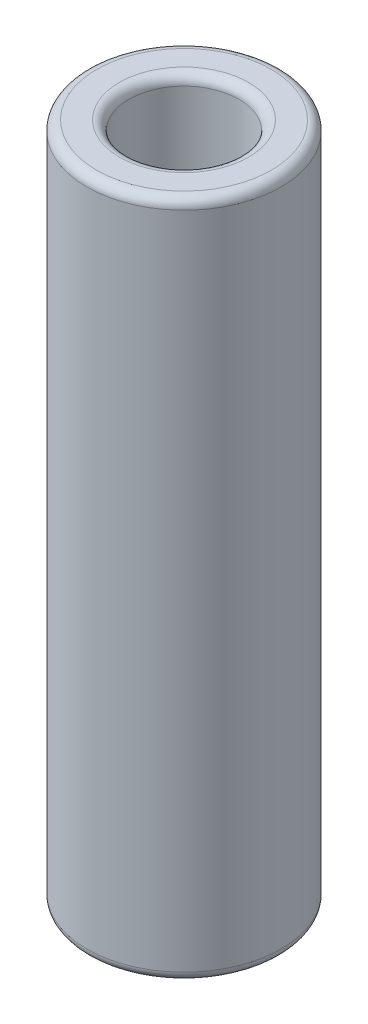
ISO-10303-21;
HEADER;
FILE_DESCRIPTION(('STEP AP214'),'2;1');
FILE_NAME('part.step','',(''),(''),'','','');
FILE_SCHEMA(('AUTOMOTIVE_DESIGN { 1 0 10303 214 1 1 1 1 }'));
ENDSEC;
DATA;
#1=APPLICATION_CONTEXT('core data for automotive mechanical design processes');
#2=APPLICATION_PROTOCOL_DEFINITION('international standard','automotive_design',2000,#1);
#3=PRODUCT_CONTEXT('',#1,'mechanical');
#4=PRODUCT('Part','Part','',(#3));
#5=PRODUCT_RELATED_PRODUCT_CATEGORY('part','',(#4));
#6=PRODUCT_DEFINITION_FORMATION('','',#4);
#7=PRODUCT_DEFINITION_CONTEXT('part definition',#1,'design');
#8=PRODUCT_DEFINITION('design','',#6,#7);
#9=PRODUCT_DEFINITION_SHAPE('','',#8);
#10=(LENGTH_UNIT() NAMED_UNIT(*) SI_UNIT(.MILLI.,.METRE.));
#11=(NAMED_UNIT(*) PLANE_ANGLE_UNIT() SI_UNIT($,.RADIAN.));
#12=(NAMED_UNIT(*) SI_UNIT($,.STERADIAN.) SOLID_ANGLE_UNIT());
#13=UNCERTAINTY_MEASURE_WITH_UNIT(LENGTH_MEASURE(1.E-05),#10,'distance_accuracy_value','');
#14=(GEOMETRIC_REPRESENTATION_CONTEXT(3) GLOBAL_UNCERTAINTY_ASSIGNED_CONTEXT((#13)) GLOBAL_UNIT_ASSIGNED_CONTEXT((#10,
#11,#12)) REPRESENTATION_CONTEXT('',''));
#15=CARTESIAN_POINT('',(0.,0.,0.));
#16=DIRECTION('',(0.,0.,1.));
#17=DIRECTION('',(1.,0.,0.));
#18=AXIS2_PLACEMENT_3D('',#15,#16,#17);
#19=CARTESIAN_POINT('',(0.,21.,0.));
#20=DIRECTION('',(0.,1.,0.));
#21=DIRECTION('',(0.,0.,1.));
#22=AXIS2_PLACEMENT_3D('',#19,#20,#21);
#23=PLANE('',#22);
#24=CARTESIAN_POINT('',(0.,21.,0.));
#25=DIRECTION('',(0.,1.,0.));
#26=DIRECTION('',(0.,0.,1.));
#27=AXIS2_PLACEMENT_3D('',#24,#25,#26);
#28=CIRCLE('',#27,2.);
#29=CARTESIAN_POINT('',(0.,21.,2.));
#30=VERTEX_POINT('',#29);
#31=EDGE_CURVE('E10',#30,#30,#28,.F.);
#32=ORIENTED_EDGE('',*,*,#31,.T.);
#33=EDGE_LOOP('',(#32));
#34=FACE_BOUND('',#33,.T.);
#35=CARTESIAN_POINT('',(0.,21.,0.));
#36=DIRECTION('',(0.,1.,0.));
#37=DIRECTION('',(0.,0.,1.));
#38=AXIS2_PLACEMENT_3D('',#35,#36,#37);
#39=CIRCLE('',#38,2.7);
#40=CARTESIAN_POINT('',(0.,21.,2.7));
#41=VERTEX_POINT('',#40);
#42=EDGE_CURVE('E49',#41,#41,#39,.T.);
#43=ORIENTED_EDGE('',*,*,#42,.T.);
#44=EDGE_LOOP('',(#43));
#45=FACE_BOUND('',#44,.T.);
#46=ADVANCED_FACE('F41',(#34,#45),#23,.T.);
#47=CARTESIAN_POINT('',(0.,0.,0.));
#48=DIRECTION('',(0.,1.,0.));
#49=DIRECTION('',(0.,0.,1.));
#50=AXIS2_PLACEMENT_3D('',#47,#48,#49);
#51=PLANE('',#50);
#52=CARTESIAN_POINT('',(0.,0.,0.));
#53=DIRECTION('',(0.,1.,0.));
#54=DIRECTION('',(0.,0.,1.));
#55=AXIS2_PLACEMENT_3D('',#52,#53,#54);
#56=CIRCLE('',#55,2.);
#57=CARTESIAN_POINT('',(0.,0.,2.));
#58=VERTEX_POINT('',#57);
#59=EDGE_CURVE('E73',#58,#58,#56,.T.);
#60=ORIENTED_EDGE('',*,*,#59,.T.);
#61=EDGE_LOOP('',(#60));
#62=FACE_BOUND('',#61,.T.);
#63=CARTESIAN_POINT('',(0.,0.,0.));
#64=DIRECTION('',(0.,1.,0.));
#65=DIRECTION('',(0.,0.,1.));
#66=AXIS2_PLACEMENT_3D('',#63,#64,#65);
#67=CIRCLE('',#66,2.7);
#68=CARTESIAN_POINT('',(0.,0.,2.7));
#69=VERTEX_POINT('',#68);
#70=EDGE_CURVE('E77',#69,#69,#67,.F.);
#71=ORIENTED_EDGE('',*,*,#70,.T.);
#72=EDGE_LOOP('',(#71));
#73=FACE_BOUND('',#72,.T.);
#74=ADVANCED_FACE('F82',(#62,#73),#51,.F.);
#75=CARTESIAN_POINT('',(0.,21.,0.));
#76=DIRECTION('',(0.,-1.,0.));
#77=DIRECTION('',(0.,0.,-1.));
#78=AXIS2_PLACEMENT_3D('',#75,#76,#77);
#79=CYLINDRICAL_SURFACE('',#78,3.);
#80=CARTESIAN_POINT('',(0.,0.300000000000002,0.));
#81=DIRECTION('',(0.,1.,0.));
#82=DIRECTION('',(0.,0.,1.));
#83=AXIS2_PLACEMENT_3D('',#80,#81,#82);
#84=CIRCLE('',#83,3.);
#85=CARTESIAN_POINT('',(0.,0.300000000000002,-3.));
#86=VERTEX_POINT('',#85);
#87=EDGE_CURVE('E54',#86,#86,#84,.T.);
#88=CARTESIAN_POINT('',(0.,20.7,0.));
#89=DIRECTION('',(0.,1.,0.));
#90=DIRECTION('',(0.,0.,1.));
#91=AXIS2_PLACEMENT_3D('',#88,#89,#90);
#92=CIRCLE('',#91,3.);
#93=CARTESIAN_POINT('',(0.,20.7,-3.));
#94=VERTEX_POINT('',#93);
#95=EDGE_CURVE('E59',#94,#94,#92,.F.);
#96=CARTESIAN_POINT('',(0.,0.300000000000002,-3.));
#97=CARTESIAN_POINT('',(0.,0.512500000000001,-3.));
#98=CARTESIAN_POINT('',(0.,0.725000000000001,-3.));
#99=CARTESIAN_POINT('',(0.,1.15,-3.));
#100=CARTESIAN_POINT('',(0.,1.3625,-3.));
#101=CARTESIAN_POINT('',(0.,1.7875,-3.));
#102=CARTESIAN_POINT('',(0.,2.,-3.));
#103=CARTESIAN_POINT('',(0.,2.425,-3.));
#104=CARTESIAN_POINT('',(0.,2.6375,-3.));
#105=CARTESIAN_POINT('',(0.,3.0625,-3.));
#106=CARTESIAN_POINT('',(0.,3.275,-3.));
#107=CARTESIAN_POINT('',(0.,3.7,-3.));
#108=CARTESIAN_POINT('',(0.,3.9125,-3.));
#109=CARTESIAN_POINT('',(0.,4.3375,-3.));
#110=CARTESIAN_POINT('',(0.,4.55,-3.));
#111=CARTESIAN_POINT('',(0.,4.975,-3.));
#112=CARTESIAN_POINT('',(0.,5.1875,-3.));
#113=CARTESIAN_POINT('',(0.,5.6125,-3.));
#114=CARTESIAN_POINT('',(0.,5.825,-3.));
#115=CARTESIAN_POINT('',(0.,6.25,-3.));
#116=CARTESIAN_POINT('',(0.,6.4625,-3.));
#117=CARTESIAN_POINT('',(0.,6.8875,-3.));
#118=CARTESIAN_POINT('',(0.,7.1,-3.));
#119=CARTESIAN_POINT('',(0.,7.525,-3.));
#120=CARTESIAN_POINT('',(0.,7.7375,-3.));
#121=CARTESIAN_POINT('',(0.,8.1625,-3.));
#122=CARTESIAN_POINT('',(0.,8.375,-3.));
#123=CARTESIAN_POINT('',(0.,8.8,-3.));
#124=CARTESIAN_POINT('',(0.,9.0125,-3.));
#125=CARTESIAN_POINT('',(0.,9.4375,-3.));
#126=CARTESIAN_POINT('',(0.,9.65,-3.));
#127=CARTESIAN_POINT('',(0.,10.075,-3.));
#128=CARTESIAN_POINT('',(0.,10.2875,-3.));
#129=CARTESIAN_POINT('',(0.,10.7125,-3.));
#130=CARTESIAN_POINT('',(0.,10.925,-3.));
#131=CARTESIAN_POINT('',(0.,11.35,-3.));
#132=CARTESIAN_POINT('',(0.,11.5625,-3.));
#133=CARTESIAN_POINT('',(0.,11.9875,-3.));
#134=CARTESIAN_POINT('',(0.,12.2,-3.));
#135=CARTESIAN_POINT('',(0.,12.625,-3.));
#136=CARTESIAN_POINT('',(0.,12.8375,-3.));
#137=CARTESIAN_POINT('',(0.,13.2625,-3.));
#138=CARTESIAN_POINT('',(0.,13.475,-3.));
#139=CARTESIAN_POINT('',(0.,13.9,-3.));
#140=CARTESIAN_POINT('',(0.,14.1125,-3.));
#141=CARTESIAN_POINT('',(0.,14.5375,-3.));
#142=CARTESIAN_POINT('',(0.,14.75,-3.));
#143=CARTESIAN_POINT('',(0.,15.175,-3.));
#144=CARTESIAN_POINT('',(0.,15.3875,-3.));
#145=CARTESIAN_POINT('',(0.,15.8125,-3.));
#146=CARTESIAN_POINT('',(0.,16.025,-3.));
#147=CARTESIAN_POINT('',(0.,16.45,-3.));
#148=CARTESIAN_POINT('',(0.,16.6625,-3.));
#149=CARTESIAN_POINT('',(0.,17.0875,-3.));
#150=CARTESIAN_POINT('',(0.,17.3,-3.));
#151=CARTESIAN_POINT('',(0.,17.725,-3.));
#152=CARTESIAN_POINT('',(0.,17.9375,-3.));
#153=CARTESIAN_POINT('',(0.,18.3625,-3.));
#154=CARTESIAN_POINT('',(0.,18.575,-3.));
#155=CARTESIAN_POINT('',(0.,19.,-3.));
#156=CARTESIAN_POINT('',(0.,19.2125,-3.));
#157=CARTESIAN_POINT('',(0.,19.6375,-3.));
#158=CARTESIAN_POINT('',(0.,19.85,-3.));
#159=CARTESIAN_POINT('',(0.,20.275,-3.));
#160=CARTESIAN_POINT('',(0.,20.4875,-3.));
#161=CARTESIAN_POINT('',(0.,20.7,-3.));
#162=B_SPLINE_CURVE_WITH_KNOTS('',3,(#96,#97,#98,#99,#100,#101,#102,#103,#104,#105,#106,#107,
#108,#109,#110,#111,#112,#113,#114,#115,#116,#117,#118,#119,#120,#121,#122,#123,#124,#125,#126,
#127,#128,#129,#130,#131,#132,#133,#134,#135,#136,#137,#138,#139,#140,#141,#142,#143,#144,#145,
#146,#147,#148,#149,#150,#151,#152,#153,#154,#155,#156,#157,#158,#159,#160,#161),.UNSPECIFIED.,
.F.,.F.,(4,2,2,2,2,2,2,2,2,2,2,2,2,2,2,2,2,2,2,2,2,2,2,2,2,2,2,2,2,2,2,2,4),(0.,
0.637499999999999,1.275,1.9125,2.55,3.1875,3.825,4.4625,5.1,5.7375,6.375,7.0125,7.65,8.2875,
8.925,9.5625,10.2,10.8375,11.475,12.1125,12.75,13.3875,14.025,14.6625,15.3,15.9375,16.575,
17.2125,17.85,18.4875,19.125,19.7625,20.4),.UNSPECIFIED.);
#163=EDGE_CURVE('BSEAM92',#86,#94,#162,.T.);
#164=ORIENTED_EDGE('',*,*,#87,.T.);
#165=ORIENTED_EDGE('',*,*,#95,.T.);
#166=ORIENTED_EDGE('',*,*,#163,.T.);
#167=ORIENTED_EDGE('',*,*,#163,.F.);
#168=EDGE_LOOP('',(#164,#166,#165,#167));
#169=FACE_BOUND('',#168,.T.);
#170=ADVANCED_FACE('F92',(#169),#79,.T.);
#171=CARTESIAN_POINT('',(0.,21.,0.));
#172=DIRECTION('',(0.,-1.,0.));
#173=DIRECTION('',(0.,0.,-1.));
#174=AXIS2_PLACEMENT_3D('',#171,#172,#173);
#175=CYLINDRICAL_SURFACE('',#174,1.7);
#176=CARTESIAN_POINT('',(0.,0.300000000000002,0.));
#177=DIRECTION('',(0.,1.,0.));
#178=DIRECTION('',(0.,0.,1.));
#179=AXIS2_PLACEMENT_3D('',#176,#177,#178);
#180=CIRCLE('',#179,1.7);
#181=CARTESIAN_POINT('',(0.,0.300000000000002,-1.7));
#182=VERTEX_POINT('',#181);
#183=EDGE_CURVE('E65',#182,#182,#180,.F.);
#184=CARTESIAN_POINT('',(0.,20.7,0.));
#185=DIRECTION('',(0.,1.,0.));
#186=DIRECTION('',(0.,0.,1.));
#187=AXIS2_PLACEMENT_3D('',#184,#185,#186);
#188=CIRCLE('',#187,1.7);
#189=CARTESIAN_POINT('',(0.,20.7,-1.7));
#190=VERTEX_POINT('',#189);
#191=EDGE_CURVE('E69',#190,#190,#188,.T.);
#192=CARTESIAN_POINT('',(0.,0.300000000000002,-1.7));
#193=CARTESIAN_POINT('',(0.,0.512500000000001,-1.7));
#194=CARTESIAN_POINT('',(0.,0.725000000000001,-1.7));
#195=CARTESIAN_POINT('',(0.,1.15,-1.7));
#196=CARTESIAN_POINT('',(0.,1.3625,-1.7));
#197=CARTESIAN_POINT('',(0.,1.7875,-1.7));
#198=CARTESIAN_POINT('',(0.,2.,-1.7));
#199=CARTESIAN_POINT('',(0.,2.425,-1.7));
#200=CARTESIAN_POINT('',(0.,2.6375,-1.7));
#201=CARTESIAN_POINT('',(0.,3.0625,-1.7));
#202=CARTESIAN_POINT('',(0.,3.275,-1.7));
#203=CARTESIAN_POINT('',(0.,3.7,-1.7));
#204=CARTESIAN_POINT('',(0.,3.9125,-1.7));
#205=CARTESIAN_POINT('',(0.,4.3375,-1.7));
#206=CARTESIAN_POINT('',(0.,4.55,-1.7));
#207=CARTESIAN_POINT('',(0.,4.975,-1.7));
#208=CARTESIAN_POINT('',(0.,5.1875,-1.7));
#209=CARTESIAN_POINT('',(0.,5.6125,-1.7));
#210=CARTESIAN_POINT('',(0.,5.825,-1.7));
#211=CARTESIAN_POINT('',(0.,6.25,-1.7));
#212=CARTESIAN_POINT('',(0.,6.4625,-1.7));
#213=CARTESIAN_POINT('',(0.,6.8875,-1.7));
#214=CARTESIAN_POINT('',(0.,7.1,-1.7));
#215=CARTESIAN_POINT('',(0.,7.525,-1.7));
#216=CARTESIAN_POINT('',(0.,7.7375,-1.7));
#217=CARTESIAN_POINT('',(0.,8.1625,-1.7));
#218=CARTESIAN_POINT('',(0.,8.375,-1.7));
#219=CARTESIAN_POINT('',(0.,8.8,-1.7));
#220=CARTESIAN_POINT('',(0.,9.0125,-1.7));
#221=CARTESIAN_POINT('',(0.,9.4375,-1.7));
#222=CARTESIAN_POINT('',(0.,9.65,-1.7));
#223=CARTESIAN_POINT('',(0.,10.075,-1.7));
#224=CARTESIAN_POINT('',(0.,10.2875,-1.7));
#225=CARTESIAN_POINT('',(0.,10.7125,-1.7));
#226=CARTESIAN_POINT('',(0.,10.925,-1.7));
#227=CARTESIAN_POINT('',(0.,11.35,-1.7));
#228=CARTESIAN_POINT('',(0.,11.5625,-1.7));
#229=CARTESIAN_POINT('',(0.,11.9875,-1.7));
#230=CARTESIAN_POINT('',(0.,12.2,-1.7));
#231=CARTESIAN_POINT('',(0.,12.625,-1.7));
#232=CARTESIAN_POINT('',(0.,12.8375,-1.7));
#233=CARTESIAN_POINT('',(0.,13.2625,-1.7));
#234=CARTESIAN_POINT('',(0.,13.475,-1.7));
#235=CARTESIAN_POINT('',(0.,13.9,-1.7));
#236=CARTESIAN_POINT('',(0.,14.1125,-1.7));
#237=CARTESIAN_POINT('',(0.,14.5375,-1.7));
#238=CARTESIAN_POINT('',(0.,14.75,-1.7));
#239=CARTESIAN_POINT('',(0.,15.175,-1.7));
#240=CARTESIAN_POINT('',(0.,15.3875,-1.7));
#241=CARTESIAN_POINT('',(0.,15.8125,-1.7));
#242=CARTESIAN_POINT('',(0.,16.025,-1.7));
#243=CARTESIAN_POINT('',(0.,16.45,-1.7));
#244=CARTESIAN_POINT('',(0.,16.6625,-1.7));
#245=CARTESIAN_POINT('',(0.,17.0875,-1.7));
#246=CARTESIAN_POINT('',(0.,17.3,-1.7));
#247=CARTESIAN_POINT('',(0.,17.725,-1.7));
#248=CARTESIAN_POINT('',(0.,17.9375,-1.7));
#249=CARTESIAN_POINT('',(0.,18.3625,-1.7));
#250=CARTESIAN_POINT('',(0.,18.575,-1.7));
#251=CARTESIAN_POINT('',(0.,19.,-1.7));
#252=CARTESIAN_POINT('',(0.,19.2125,-1.7));
#253=CARTESIAN_POINT('',(0.,19.6375,-1.7));
#254=CARTESIAN_POINT('',(0.,19.85,-1.7));
#255=CARTESIAN_POINT('',(0.,20.275,-1.7));
#256=CARTESIAN_POINT('',(0.,20.4875,-1.7));
#257=CARTESIAN_POINT('',(0.,20.7,-1.7));
#258=B_SPLINE_CURVE_WITH_KNOTS('',3,(#192,#193,#194,#195,#196,#197,#198,#199,#200,#201,#202,
#203,#204,#205,#206,#207,#208,#209,#210,#211,#212,#213,#214,#215,#216,#217,#218,#219,#220,#221,
#222,#223,#224,#225,#226,#227,#228,#229,#230,#231,#232,#233,#234,#235,#236,#237,#238,#239,#240,
#241,#242,#243,#244,#245,#246,#247,#248,#249,#250,#251,#252,#253,#254,#255,#256,#257),
.UNSPECIFIED.,.F.,.F.,(4,2,2,2,2,2,2,2,2,2,2,2,2,2,2,2,2,2,2,2,2,2,2,2,2,2,2,2,2,2,2,2,4),(0.,
0.637499999999999,1.275,1.9125,2.55,3.1875,3.825,4.4625,5.1,5.7375,6.375,7.0125,7.65,8.2875,
8.925,9.5625,10.2,10.8375,11.475,12.1125,12.75,13.3875,14.025,14.6625,15.3,15.9375,16.575,
17.2125,17.85,18.4875,19.125,19.7625,20.4),.UNSPECIFIED.);
#259=EDGE_CURVE('BSEAM95',#182,#190,#258,.T.);
#260=ORIENTED_EDGE('',*,*,#183,.T.);
#261=ORIENTED_EDGE('',*,*,#191,.T.);
#262=ORIENTED_EDGE('',*,*,#259,.T.);
#263=ORIENTED_EDGE('',*,*,#259,.F.);
#264=EDGE_LOOP('',(#260,#262,#261,#263));
#265=FACE_BOUND('',#264,.T.);
#266=ADVANCED_FACE('F95',(#265),#175,.F.);
#267=CARTESIAN_POINT('',(0.,0.300000000000002,0.));
#268=DIRECTION('',(0.,1.,0.));
#269=DIRECTION('',(0.,0.,1.));
#270=AXIS2_PLACEMENT_3D('',#267,#268,#269);
#271=TOROIDAL_SURFACE('',#270,2.,0.3);
#272=ORIENTED_EDGE('',*,*,#183,.F.);
#273=EDGE_LOOP('',(#272));
#274=FACE_BOUND('',#273,.T.);
#275=ORIENTED_EDGE('',*,*,#59,.F.);
#276=EDGE_LOOP('',(#275));
#277=FACE_BOUND('',#276,.T.);
#278=ADVANCED_FACE('F88',(#274,#277),#271,.T.);
#279=CARTESIAN_POINT('',(0.,0.300000000000002,0.));
#280=DIRECTION('',(0.,1.,0.));
#281=DIRECTION('',(0.,0.,1.));
#282=AXIS2_PLACEMENT_3D('',#279,#280,#281);
#283=TOROIDAL_SURFACE('',#282,2.7,0.3);
#284=ORIENTED_EDGE('',*,*,#70,.F.);
#285=EDGE_LOOP('',(#284));
#286=FACE_BOUND('',#285,.T.);
#287=ORIENTED_EDGE('',*,*,#87,.F.);
#288=EDGE_LOOP('',(#287));
#289=FACE_BOUND('',#288,.T.);
#290=ADVANCED_FACE('F84',(#286,#289),#283,.T.);
#291=CARTESIAN_POINT('',(0.,20.7,0.));
#292=DIRECTION('',(0.,1.,0.));
#293=DIRECTION('',(0.,0.,1.));
#294=AXIS2_PLACEMENT_3D('',#291,#292,#293);
#295=TOROIDAL_SURFACE('',#294,2.,0.3);
#296=ORIENTED_EDGE('',*,*,#31,.F.);
#297=EDGE_LOOP('',(#296));
#298=FACE_BOUND('',#297,.T.);
#299=ORIENTED_EDGE('',*,*,#191,.F.);
#300=EDGE_LOOP('',(#299));
#301=FACE_BOUND('',#300,.T.);
#302=ADVANCED_FACE('F87',(#298,#301),#295,.T.);
#303=CARTESIAN_POINT('',(0.,20.7,0.));
#304=DIRECTION('',(0.,1.,0.));
#305=DIRECTION('',(0.,0.,1.));
#306=AXIS2_PLACEMENT_3D('',#303,#304,#305);
#307=TOROIDAL_SURFACE('',#306,2.7,0.3);
#308=ORIENTED_EDGE('',*,*,#95,.F.);
#309=EDGE_LOOP('',(#308));
#310=FACE_BOUND('',#309,.T.);
#311=ORIENTED_EDGE('',*,*,#42,.F.);
#312=EDGE_LOOP('',(#311));
#313=FACE_BOUND('',#312,.T.);
#314=ADVANCED_FACE('F43',(#310,#313),#307,.T.);
#315=CLOSED_SHELL('',(#46,#74,#170,#266,#278,#290,#302,#314));
#316=MANIFOLD_SOLID_BREP('B2',#315);
#317=ADVANCED_BREP_SHAPE_REPRESENTATION('',(#18,#316),#14);
#318=SHAPE_DEFINITION_REPRESENTATION(#9,#317);
ENDSEC;
END-ISO-10303-21;
